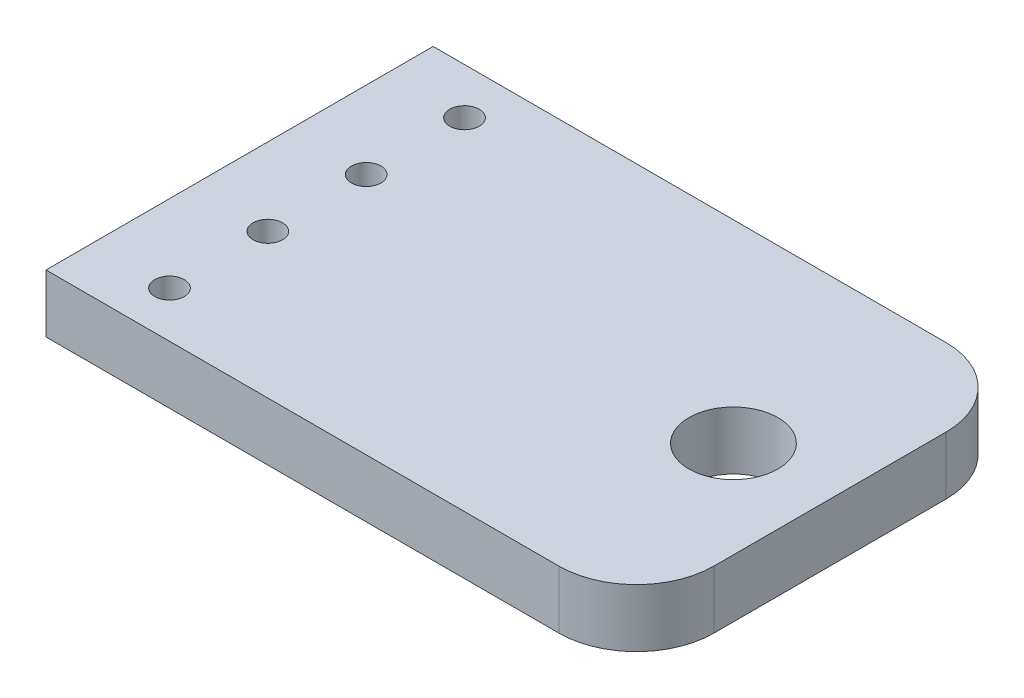
ISO-10303-21;
HEADER;
FILE_DESCRIPTION(('STEP AP214'),'2;1');
FILE_NAME('part.step','',(''),(''),'','','');
FILE_SCHEMA(('AUTOMOTIVE_DESIGN { 1 0 10303 214 1 1 1 1 }'));
ENDSEC;
DATA;
#1=APPLICATION_CONTEXT('core data for automotive mechanical design processes');
#2=APPLICATION_PROTOCOL_DEFINITION('international standard','automotive_design',2000,#1);
#3=PRODUCT_CONTEXT('',#1,'mechanical');
#4=PRODUCT('Part','Part','',(#3));
#5=PRODUCT_RELATED_PRODUCT_CATEGORY('part','',(#4));
#6=PRODUCT_DEFINITION_FORMATION('','',#4);
#7=PRODUCT_DEFINITION_CONTEXT('part definition',#1,'design');
#8=PRODUCT_DEFINITION('design','',#6,#7);
#9=PRODUCT_DEFINITION_SHAPE('','',#8);
#10=(LENGTH_UNIT() NAMED_UNIT(*) SI_UNIT(.MILLI.,.METRE.));
#11=(NAMED_UNIT(*) PLANE_ANGLE_UNIT() SI_UNIT($,.RADIAN.));
#12=(NAMED_UNIT(*) SI_UNIT($,.STERADIAN.) SOLID_ANGLE_UNIT());
#13=UNCERTAINTY_MEASURE_WITH_UNIT(LENGTH_MEASURE(1.E-05),#10,'distance_accuracy_value','');
#14=(GEOMETRIC_REPRESENTATION_CONTEXT(3) GLOBAL_UNCERTAINTY_ASSIGNED_CONTEXT((#13)) GLOBAL_UNIT_ASSIGNED_CONTEXT((#10,
#11,#12)) REPRESENTATION_CONTEXT('',''));
#15=CARTESIAN_POINT('',(0.,0.,0.));
#16=DIRECTION('',(0.,0.,1.));
#17=DIRECTION('',(1.,0.,0.));
#18=AXIS2_PLACEMENT_3D('',#15,#16,#17);
#19=CARTESIAN_POINT('',(0.,1.5,0.));
#20=DIRECTION('',(0.,-1.,0.));
#21=DIRECTION('',(0.,0.,-1.));
#22=AXIS2_PLACEMENT_3D('',#19,#20,#21);
#23=PLANE('',#22);
#24=DIRECTION('',(0.,0.,-1.));
#25=VECTOR('',#24,1.);
#26=CARTESIAN_POINT('',(15.25,1.5,0.));
#27=LINE('',#26,#25);
#28=CARTESIAN_POINT('',(15.25,1.5,-2.));
#29=VERTEX_POINT('',#28);
#30=CARTESIAN_POINT('',(15.25,1.5,-8.));
#31=VERTEX_POINT('',#30);
#32=EDGE_CURVE('E93',#29,#31,#27,.T.);
#33=ORIENTED_EDGE('',*,*,#32,.T.);
#34=CARTESIAN_POINT('',(13.25,1.5,-8.));
#35=DIRECTION('',(0.,-1.,0.));
#36=DIRECTION('',(0.,0.,-1.));
#37=AXIS2_PLACEMENT_3D('',#34,#35,#36);
#38=CIRCLE('',#37,2.);
#39=CARTESIAN_POINT('',(13.25,1.5,-10.));
#40=VERTEX_POINT('',#39);
#41=EDGE_CURVE('E41',#31,#40,#38,.F.);
#42=ORIENTED_EDGE('',*,*,#41,.T.);
#43=DIRECTION('',(-1.,0.,0.));
#44=VECTOR('',#43,1.);
#45=CARTESIAN_POINT('',(0.,1.5,-10.));
#46=LINE('',#45,#44);
#47=CARTESIAN_POINT('',(0.,1.5,-10.));
#48=VERTEX_POINT('',#47);
#49=EDGE_CURVE('E99',#40,#48,#46,.T.);
#50=ORIENTED_EDGE('',*,*,#49,.T.);
#51=DIRECTION('',(0.,0.,1.));
#52=VECTOR('',#51,1.);
#53=CARTESIAN_POINT('',(0.,1.5,0.));
#54=LINE('',#53,#52);
#55=CARTESIAN_POINT('',(0.,1.5,0.));
#56=VERTEX_POINT('',#55);
#57=EDGE_CURVE('E94',#48,#56,#54,.T.);
#58=ORIENTED_EDGE('',*,*,#57,.T.);
#59=DIRECTION('',(1.,0.,0.));
#60=VECTOR('',#59,1.);
#61=CARTESIAN_POINT('',(0.,1.5,0.));
#62=LINE('',#61,#60);
#63=CARTESIAN_POINT('',(13.25,1.5,0.));
#64=VERTEX_POINT('',#63);
#65=EDGE_CURVE('E85',#56,#64,#62,.T.);
#66=ORIENTED_EDGE('',*,*,#65,.T.);
#67=CARTESIAN_POINT('',(13.25,1.5,-2.));
#68=DIRECTION('',(0.,-1.,0.));
#69=DIRECTION('',(0.,0.,-1.));
#70=AXIS2_PLACEMENT_3D('',#67,#68,#69);
#71=CIRCLE('',#70,2.);
#72=EDGE_CURVE('E124',#64,#29,#71,.F.);
#73=ORIENTED_EDGE('',*,*,#72,.T.);
#74=EDGE_LOOP('',(#33,#42,#50,#58,#66,#73));
#75=FACE_BOUND('',#74,.T.);
#76=CARTESIAN_POINT('',(12.7557411273487,1.5,-5.));
#77=DIRECTION('',(0.,1.,0.));
#78=DIRECTION('',(0.,0.,1.));
#79=AXIS2_PLACEMENT_3D('',#76,#77,#78);
#80=CIRCLE('',#79,1.15);
#81=CARTESIAN_POINT('',(12.7557411273487,1.5,-3.85));
#82=VERTEX_POINT('',#81);
#83=EDGE_CURVE('E144',#82,#82,#80,.T.);
#84=ORIENTED_EDGE('',*,*,#83,.F.);
#85=EDGE_LOOP('',(#84));
#86=FACE_BOUND('',#85,.T.);
#87=CARTESIAN_POINT('',(2.,1.5,-6.27));
#88=DIRECTION('',(0.,1.,0.));
#89=DIRECTION('',(0.,0.,1.));
#90=AXIS2_PLACEMENT_3D('',#87,#88,#89);
#91=CIRCLE('',#90,0.381);
#92=CARTESIAN_POINT('',(2.,1.5,-5.889));
#93=VERTEX_POINT('',#92);
#94=EDGE_CURVE('E150',#93,#93,#91,.T.);
#95=ORIENTED_EDGE('',*,*,#94,.F.);
#96=EDGE_LOOP('',(#95));
#97=FACE_BOUND('',#96,.T.);
#98=CARTESIAN_POINT('',(2.,1.5,-3.73));
#99=DIRECTION('',(0.,1.,0.));
#100=DIRECTION('',(0.,0.,1.));
#101=AXIS2_PLACEMENT_3D('',#98,#99,#100);
#102=CIRCLE('',#101,0.381);
#103=CARTESIAN_POINT('',(2.,1.5,-3.349));
#104=VERTEX_POINT('',#103);
#105=EDGE_CURVE('E156',#104,#104,#102,.T.);
#106=ORIENTED_EDGE('',*,*,#105,.F.);
#107=EDGE_LOOP('',(#106));
#108=FACE_BOUND('',#107,.T.);
#109=CARTESIAN_POINT('',(2.,1.5,-1.19));
#110=DIRECTION('',(0.,1.,0.));
#111=DIRECTION('',(0.,0.,1.));
#112=AXIS2_PLACEMENT_3D('',#109,#110,#111);
#113=CIRCLE('',#112,0.381);
#114=CARTESIAN_POINT('',(2.,1.5,-0.809));
#115=VERTEX_POINT('',#114);
#116=EDGE_CURVE('E162',#115,#115,#113,.T.);
#117=ORIENTED_EDGE('',*,*,#116,.F.);
#118=EDGE_LOOP('',(#117));
#119=FACE_BOUND('',#118,.T.);
#120=CARTESIAN_POINT('',(2.,1.5,-8.81));
#121=DIRECTION('',(0.,1.,0.));
#122=DIRECTION('',(0.,0.,1.));
#123=AXIS2_PLACEMENT_3D('',#120,#121,#122);
#124=CIRCLE('',#123,0.381);
#125=CARTESIAN_POINT('',(2.,1.5,-8.429));
#126=VERTEX_POINT('',#125);
#127=EDGE_CURVE('E168',#126,#126,#124,.T.);
#128=ORIENTED_EDGE('',*,*,#127,.F.);
#129=EDGE_LOOP('',(#128));
#130=FACE_BOUND('',#129,.T.);
#131=ADVANCED_FACE('F33',(#75,#86,#97,#108,#119,#130),#23,.F.);
#132=CARTESIAN_POINT('',(0.,0.,0.));
#133=DIRECTION('',(0.,-1.,0.));
#134=DIRECTION('',(0.,0.,-1.));
#135=AXIS2_PLACEMENT_3D('',#132,#133,#134);
#136=PLANE('',#135);
#137=CARTESIAN_POINT('',(2.,0.,-1.19));
#138=DIRECTION('',(0.,1.,0.));
#139=DIRECTION('',(0.,0.,1.));
#140=AXIS2_PLACEMENT_3D('',#137,#138,#139);
#141=CIRCLE('',#140,0.381);
#142=CARTESIAN_POINT('',(2.,0.,-0.809));
#143=VERTEX_POINT('',#142);
#144=EDGE_CURVE('E165',#143,#143,#141,.T.);
#145=ORIENTED_EDGE('',*,*,#144,.T.);
#146=EDGE_LOOP('',(#145));
#147=FACE_BOUND('',#146,.T.);
#148=CARTESIAN_POINT('',(2.,0.,-6.27));
#149=DIRECTION('',(0.,1.,0.));
#150=DIRECTION('',(0.,0.,1.));
#151=AXIS2_PLACEMENT_3D('',#148,#149,#150);
#152=CIRCLE('',#151,0.381);
#153=CARTESIAN_POINT('',(2.,0.,-5.889));
#154=VERTEX_POINT('',#153);
#155=EDGE_CURVE('E153',#154,#154,#152,.T.);
#156=ORIENTED_EDGE('',*,*,#155,.T.);
#157=EDGE_LOOP('',(#156));
#158=FACE_BOUND('',#157,.T.);
#159=DIRECTION('',(-1.,0.,0.));
#160=VECTOR('',#159,1.);
#161=CARTESIAN_POINT('',(0.,0.,-10.));
#162=LINE('',#161,#160);
#163=CARTESIAN_POINT('',(13.25,0.,-10.));
#164=VERTEX_POINT('',#163);
#165=CARTESIAN_POINT('',(0.,0.,-10.));
#166=VERTEX_POINT('',#165);
#167=EDGE_CURVE('E103',#164,#166,#162,.T.);
#168=ORIENTED_EDGE('',*,*,#167,.F.);
#169=CARTESIAN_POINT('',(13.25,0.,-8.));
#170=DIRECTION('',(0.,-1.,0.));
#171=DIRECTION('',(0.,0.,-1.));
#172=AXIS2_PLACEMENT_3D('',#169,#170,#171);
#173=CIRCLE('',#172,2.);
#174=CARTESIAN_POINT('',(15.25,0.,-8.));
#175=VERTEX_POINT('',#174);
#176=EDGE_CURVE('E118',#164,#175,#173,.T.);
#177=ORIENTED_EDGE('',*,*,#176,.T.);
#178=DIRECTION('',(0.,0.,-1.));
#179=VECTOR('',#178,1.);
#180=CARTESIAN_POINT('',(15.25,0.,0.));
#181=LINE('',#180,#179);
#182=CARTESIAN_POINT('',(15.25,0.,-2.));
#183=VERTEX_POINT('',#182);
#184=EDGE_CURVE('E137',#183,#175,#181,.T.);
#185=ORIENTED_EDGE('',*,*,#184,.F.);
#186=CARTESIAN_POINT('',(13.25,0.,-2.));
#187=DIRECTION('',(0.,-1.,0.));
#188=DIRECTION('',(0.,0.,-1.));
#189=AXIS2_PLACEMENT_3D('',#186,#187,#188);
#190=CIRCLE('',#189,2.);
#191=CARTESIAN_POINT('',(13.25,0.,0.));
#192=VERTEX_POINT('',#191);
#193=EDGE_CURVE('E112',#183,#192,#190,.T.);
#194=ORIENTED_EDGE('',*,*,#193,.T.);
#195=DIRECTION('',(1.,0.,0.));
#196=VECTOR('',#195,1.);
#197=CARTESIAN_POINT('',(0.,0.,0.));
#198=LINE('',#197,#196);
#199=CARTESIAN_POINT('',(0.,0.,0.));
#200=VERTEX_POINT('',#199);
#201=EDGE_CURVE('E140',#200,#192,#198,.T.);
#202=ORIENTED_EDGE('',*,*,#201,.F.);
#203=DIRECTION('',(0.,0.,1.));
#204=VECTOR('',#203,1.);
#205=CARTESIAN_POINT('',(0.,0.,0.));
#206=LINE('',#205,#204);
#207=EDGE_CURVE('E107',#166,#200,#206,.T.);
#208=ORIENTED_EDGE('',*,*,#207,.F.);
#209=EDGE_LOOP('',(#168,#177,#185,#194,#202,#208));
#210=FACE_BOUND('',#209,.T.);
#211=CARTESIAN_POINT('',(12.7557411273487,0.,-5.));
#212=DIRECTION('',(0.,1.,0.));
#213=DIRECTION('',(0.,0.,1.));
#214=AXIS2_PLACEMENT_3D('',#211,#212,#213);
#215=CIRCLE('',#214,1.15);
#216=CARTESIAN_POINT('',(12.7557411273487,0.,-3.85));
#217=VERTEX_POINT('',#216);
#218=EDGE_CURVE('E147',#217,#217,#215,.T.);
#219=ORIENTED_EDGE('',*,*,#218,.T.);
#220=EDGE_LOOP('',(#219));
#221=FACE_BOUND('',#220,.T.);
#222=CARTESIAN_POINT('',(2.,0.,-3.73));
#223=DIRECTION('',(0.,1.,0.));
#224=DIRECTION('',(0.,0.,1.));
#225=AXIS2_PLACEMENT_3D('',#222,#223,#224);
#226=CIRCLE('',#225,0.381);
#227=CARTESIAN_POINT('',(2.,0.,-3.349));
#228=VERTEX_POINT('',#227);
#229=EDGE_CURVE('E159',#228,#228,#226,.T.);
#230=ORIENTED_EDGE('',*,*,#229,.T.);
#231=EDGE_LOOP('',(#230));
#232=FACE_BOUND('',#231,.T.);
#233=CARTESIAN_POINT('',(2.,0.,-8.81));
#234=DIRECTION('',(0.,1.,0.));
#235=DIRECTION('',(0.,0.,1.));
#236=AXIS2_PLACEMENT_3D('',#233,#234,#235);
#237=CIRCLE('',#236,0.381);
#238=CARTESIAN_POINT('',(2.,0.,-8.429));
#239=VERTEX_POINT('',#238);
#240=EDGE_CURVE('E171',#239,#239,#237,.T.);
#241=ORIENTED_EDGE('',*,*,#240,.T.);
#242=EDGE_LOOP('',(#241));
#243=FACE_BOUND('',#242,.T.);
#244=ADVANCED_FACE('F135',(#147,#158,#210,#221,#232,#243),#136,.T.);
#245=CARTESIAN_POINT('',(0.,1.5,0.));
#246=DIRECTION('',(1.,0.,0.));
#247=DIRECTION('',(0.,0.,-1.));
#248=AXIS2_PLACEMENT_3D('',#245,#246,#247);
#249=PLANE('',#248);
#250=ORIENTED_EDGE('',*,*,#207,.T.);
#251=DIRECTION('',(0.,-1.,0.));
#252=VECTOR('',#251,1.);
#253=CARTESIAN_POINT('',(0.,1.5,0.));
#254=LINE('',#253,#252);
#255=EDGE_CURVE('E89',#56,#200,#254,.T.);
#256=ORIENTED_EDGE('',*,*,#255,.F.);
#257=ORIENTED_EDGE('',*,*,#57,.F.);
#258=DIRECTION('',(0.,-1.,0.));
#259=VECTOR('',#258,1.);
#260=CARTESIAN_POINT('',(0.,1.5,-10.));
#261=LINE('',#260,#259);
#262=EDGE_CURVE('E109',#48,#166,#261,.T.);
#263=ORIENTED_EDGE('',*,*,#262,.T.);
#264=EDGE_LOOP('',(#250,#256,#257,#263));
#265=FACE_BOUND('',#264,.T.);
#266=ADVANCED_FACE('F105',(#265),#249,.F.);
#267=CARTESIAN_POINT('',(0.,1.5,0.));
#268=DIRECTION('',(0.,0.,-1.));
#269=DIRECTION('',(-1.,0.,0.));
#270=AXIS2_PLACEMENT_3D('',#267,#268,#269);
#271=PLANE('',#270);
#272=ORIENTED_EDGE('',*,*,#201,.T.);
#273=DIRECTION('',(0.,-1.,0.));
#274=VECTOR('',#273,1.);
#275=CARTESIAN_POINT('',(13.25,1.5,0.));
#276=LINE('',#275,#274);
#277=EDGE_CURVE('E11',#192,#64,#276,.F.);
#278=ORIENTED_EDGE('',*,*,#277,.T.);
#279=ORIENTED_EDGE('',*,*,#65,.F.);
#280=ORIENTED_EDGE('',*,*,#255,.T.);
#281=EDGE_LOOP('',(#272,#278,#279,#280));
#282=FACE_BOUND('',#281,.T.);
#283=ADVANCED_FACE('F87',(#282),#271,.F.);
#284=CARTESIAN_POINT('',(15.25,1.5,0.));
#285=DIRECTION('',(-1.,0.,0.));
#286=DIRECTION('',(0.,0.,1.));
#287=AXIS2_PLACEMENT_3D('',#284,#285,#286);
#288=PLANE('',#287);
#289=ORIENTED_EDGE('',*,*,#184,.T.);
#290=DIRECTION('',(0.,-1.,0.));
#291=VECTOR('',#290,1.);
#292=CARTESIAN_POINT('',(15.25,1.5,-8.));
#293=LINE('',#292,#291);
#294=EDGE_CURVE('E54',#175,#31,#293,.F.);
#295=ORIENTED_EDGE('',*,*,#294,.T.);
#296=ORIENTED_EDGE('',*,*,#32,.F.);
#297=DIRECTION('',(0.,-1.,0.));
#298=VECTOR('',#297,1.);
#299=CARTESIAN_POINT('',(15.25,1.5,-2.));
#300=LINE('',#299,#298);
#301=EDGE_CURVE('E120',#29,#183,#300,.T.);
#302=ORIENTED_EDGE('',*,*,#301,.T.);
#303=EDGE_LOOP('',(#289,#295,#296,#302));
#304=FACE_BOUND('',#303,.T.);
#305=ADVANCED_FACE('F138',(#304),#288,.F.);
#306=CARTESIAN_POINT('',(0.,1.5,-10.));
#307=DIRECTION('',(0.,0.,1.));
#308=DIRECTION('',(1.,0.,0.));
#309=AXIS2_PLACEMENT_3D('',#306,#307,#308);
#310=PLANE('',#309);
#311=ORIENTED_EDGE('',*,*,#49,.F.);
#312=DIRECTION('',(0.,-1.,0.));
#313=VECTOR('',#312,1.);
#314=CARTESIAN_POINT('',(13.25,1.5,-10.));
#315=LINE('',#314,#313);
#316=EDGE_CURVE('E108',#40,#164,#315,.T.);
#317=ORIENTED_EDGE('',*,*,#316,.T.);
#318=ORIENTED_EDGE('',*,*,#167,.T.);
#319=ORIENTED_EDGE('',*,*,#262,.F.);
#320=EDGE_LOOP('',(#311,#317,#318,#319));
#321=FACE_BOUND('',#320,.T.);
#322=ADVANCED_FACE('F129',(#321),#310,.F.);
#323=CARTESIAN_POINT('',(12.7557411273487,1.5,-5.));
#324=DIRECTION('',(0.,-1.,0.));
#325=DIRECTION('',(0.,0.,-1.));
#326=AXIS2_PLACEMENT_3D('',#323,#324,#325);
#327=CYLINDRICAL_SURFACE('',#326,1.15);
#328=ORIENTED_EDGE('',*,*,#83,.T.);
#329=EDGE_LOOP('',(#328));
#330=FACE_BOUND('',#329,.T.);
#331=ORIENTED_EDGE('',*,*,#218,.F.);
#332=EDGE_LOOP('',(#331));
#333=FACE_BOUND('',#332,.T.);
#334=ADVANCED_FACE('F188',(#330,#333),#327,.F.);
#335=CARTESIAN_POINT('',(2.,1.5,-6.27));
#336=DIRECTION('',(0.,-1.,0.));
#337=DIRECTION('',(0.,0.,-1.));
#338=AXIS2_PLACEMENT_3D('',#335,#336,#337);
#339=CYLINDRICAL_SURFACE('',#338,0.381);
#340=ORIENTED_EDGE('',*,*,#94,.T.);
#341=EDGE_LOOP('',(#340));
#342=FACE_BOUND('',#341,.T.);
#343=ORIENTED_EDGE('',*,*,#155,.F.);
#344=EDGE_LOOP('',(#343));
#345=FACE_BOUND('',#344,.T.);
#346=ADVANCED_FACE('F214',(#342,#345),#339,.F.);
#347=CARTESIAN_POINT('',(2.,1.5,-3.73));
#348=DIRECTION('',(0.,-1.,0.));
#349=DIRECTION('',(0.,0.,-1.));
#350=AXIS2_PLACEMENT_3D('',#347,#348,#349);
#351=CYLINDRICAL_SURFACE('',#350,0.381);
#352=ORIENTED_EDGE('',*,*,#105,.T.);
#353=EDGE_LOOP('',(#352));
#354=FACE_BOUND('',#353,.T.);
#355=ORIENTED_EDGE('',*,*,#229,.F.);
#356=EDGE_LOOP('',(#355));
#357=FACE_BOUND('',#356,.T.);
#358=ADVANCED_FACE('F209',(#354,#357),#351,.F.);
#359=CARTESIAN_POINT('',(2.,1.5,-1.19));
#360=DIRECTION('',(0.,-1.,0.));
#361=DIRECTION('',(0.,0.,-1.));
#362=AXIS2_PLACEMENT_3D('',#359,#360,#361);
#363=CYLINDRICAL_SURFACE('',#362,0.381);
#364=ORIENTED_EDGE('',*,*,#116,.T.);
#365=EDGE_LOOP('',(#364));
#366=FACE_BOUND('',#365,.T.);
#367=ORIENTED_EDGE('',*,*,#144,.F.);
#368=EDGE_LOOP('',(#367));
#369=FACE_BOUND('',#368,.T.);
#370=ADVANCED_FACE('F204',(#366,#369),#363,.F.);
#371=CARTESIAN_POINT('',(2.,1.5,-8.81));
#372=DIRECTION('',(0.,-1.,0.));
#373=DIRECTION('',(0.,0.,-1.));
#374=AXIS2_PLACEMENT_3D('',#371,#372,#373);
#375=CYLINDRICAL_SURFACE('',#374,0.381);
#376=ORIENTED_EDGE('',*,*,#127,.T.);
#377=EDGE_LOOP('',(#376));
#378=FACE_BOUND('',#377,.T.);
#379=ORIENTED_EDGE('',*,*,#240,.F.);
#380=EDGE_LOOP('',(#379));
#381=FACE_BOUND('',#380,.T.);
#382=ADVANCED_FACE('F177',(#378,#381),#375,.F.);
#383=CARTESIAN_POINT('',(13.25,1.5,-8.));
#384=DIRECTION('',(0.,-1.,0.));
#385=DIRECTION('',(0.,0.,-1.));
#386=AXIS2_PLACEMENT_3D('',#383,#384,#385);
#387=CYLINDRICAL_SURFACE('',#386,2.);
#388=ORIENTED_EDGE('',*,*,#41,.F.);
#389=ORIENTED_EDGE('',*,*,#294,.F.);
#390=ORIENTED_EDGE('',*,*,#176,.F.);
#391=ORIENTED_EDGE('',*,*,#316,.F.);
#392=EDGE_LOOP('',(#388,#389,#390,#391));
#393=FACE_BOUND('',#392,.T.);
#394=ADVANCED_FACE('F132',(#393),#387,.T.);
#395=CARTESIAN_POINT('',(13.25,1.5,-2.));
#396=DIRECTION('',(0.,-1.,0.));
#397=DIRECTION('',(0.,0.,-1.));
#398=AXIS2_PLACEMENT_3D('',#395,#396,#397);
#399=CYLINDRICAL_SURFACE('',#398,2.);
#400=ORIENTED_EDGE('',*,*,#72,.F.);
#401=ORIENTED_EDGE('',*,*,#277,.F.);
#402=ORIENTED_EDGE('',*,*,#193,.F.);
#403=ORIENTED_EDGE('',*,*,#301,.F.);
#404=EDGE_LOOP('',(#400,#401,#402,#403));
#405=FACE_BOUND('',#404,.T.);
#406=ADVANCED_FACE('F35',(#405),#399,.T.);
#407=CLOSED_SHELL('',(#131,#244,#266,#283,#305,#322,#334,#346,#358,#370,#382,#394,#406));
#408=MANIFOLD_SOLID_BREP('B2',#407);
#409=ADVANCED_BREP_SHAPE_REPRESENTATION('',(#18,#408),#14);
#410=SHAPE_DEFINITION_REPRESENTATION(#9,#409);
ENDSEC;
END-ISO-10303-21;
